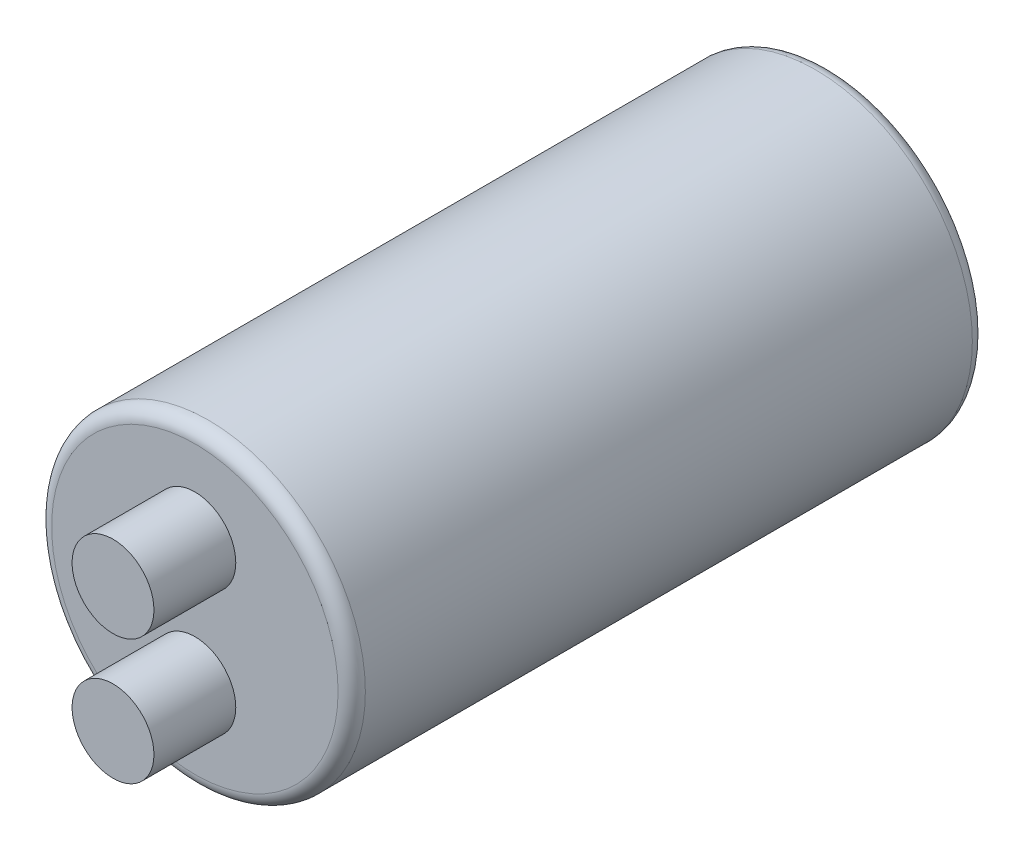
ISO-10303-21;
HEADER;
FILE_DESCRIPTION(('STEP AP214'),'2;1');
FILE_NAME('part.step','',(''),(''),'','','');
FILE_SCHEMA(('AUTOMOTIVE_DESIGN { 1 0 10303 214 1 1 1 1 }'));
ENDSEC;
DATA;
#1=APPLICATION_CONTEXT('core data for automotive mechanical design processes');
#2=APPLICATION_PROTOCOL_DEFINITION('international standard','automotive_design',2000,#1);
#3=PRODUCT_CONTEXT('',#1,'mechanical');
#4=PRODUCT('Part','Part','',(#3));
#5=PRODUCT_RELATED_PRODUCT_CATEGORY('part','',(#4));
#6=PRODUCT_DEFINITION_FORMATION('','',#4);
#7=PRODUCT_DEFINITION_CONTEXT('part definition',#1,'design');
#8=PRODUCT_DEFINITION('design','',#6,#7);
#9=PRODUCT_DEFINITION_SHAPE('','',#8);
#10=(LENGTH_UNIT() NAMED_UNIT(*) SI_UNIT(.MILLI.,.METRE.));
#11=(NAMED_UNIT(*) PLANE_ANGLE_UNIT() SI_UNIT($,.RADIAN.));
#12=(NAMED_UNIT(*) SI_UNIT($,.STERADIAN.) SOLID_ANGLE_UNIT());
#13=UNCERTAINTY_MEASURE_WITH_UNIT(LENGTH_MEASURE(1.E-05),#10,'distance_accuracy_value','');
#14=(GEOMETRIC_REPRESENTATION_CONTEXT(3) GLOBAL_UNCERTAINTY_ASSIGNED_CONTEXT((#13)) GLOBAL_UNIT_ASSIGNED_CONTEXT((#10,
#11,#12)) REPRESENTATION_CONTEXT('',''));
#15=CARTESIAN_POINT('',(0.,0.,0.));
#16=DIRECTION('',(0.,0.,1.));
#17=DIRECTION('',(1.,0.,0.));
#18=AXIS2_PLACEMENT_3D('',#15,#16,#17);
#19=CARTESIAN_POINT('',(0.,0.,46.5));
#20=DIRECTION('',(0.,0.,1.));
#21=DIRECTION('',(1.,0.,0.));
#22=AXIS2_PLACEMENT_3D('',#19,#20,#21);
#23=PLANE('',#22);
#24=CARTESIAN_POINT('',(0.,-4.74446928174643,46.5));
#25=DIRECTION('',(0.,0.,1.));
#26=DIRECTION('',(1.,0.,0.));
#27=AXIS2_PLACEMENT_3D('',#24,#25,#26);
#28=CIRCLE('',#27,3.);
#29=CARTESIAN_POINT('',(3.,-4.74446928174643,46.5));
#30=VERTEX_POINT('',#29);
#31=EDGE_CURVE('E51',#30,#30,#28,.T.);
#32=ORIENTED_EDGE('',*,*,#31,.F.);
#33=EDGE_LOOP('',(#32));
#34=FACE_BOUND('',#33,.T.);
#35=CARTESIAN_POINT('',(0.,0.,46.5));
#36=DIRECTION('',(0.,0.,1.));
#37=DIRECTION('',(1.,0.,0.));
#38=AXIS2_PLACEMENT_3D('',#35,#36,#37);
#39=CIRCLE('',#38,10.5);
#40=CARTESIAN_POINT('',(10.5,0.,46.5));
#41=VERTEX_POINT('',#40);
#42=EDGE_CURVE('E45',#41,#41,#39,.T.);
#43=ORIENTED_EDGE('',*,*,#42,.T.);
#44=EDGE_LOOP('',(#43));
#45=FACE_BOUND('',#44,.T.);
#46=CARTESIAN_POINT('',(0.,4.44181711904434,46.5));
#47=DIRECTION('',(0.,0.,1.));
#48=DIRECTION('',(1.,0.,0.));
#49=AXIS2_PLACEMENT_3D('',#46,#47,#48);
#50=CIRCLE('',#49,3.);
#51=CARTESIAN_POINT('',(3.,4.44181711904434,46.5));
#52=VERTEX_POINT('',#51);
#53=EDGE_CURVE('E57',#52,#52,#50,.T.);
#54=ORIENTED_EDGE('',*,*,#53,.F.);
#55=EDGE_LOOP('',(#54));
#56=FACE_BOUND('',#55,.T.);
#57=ADVANCED_FACE('F30',(#34,#45,#56),#23,.T.);
#58=CARTESIAN_POINT('',(0.,0.,46.5));
#59=DIRECTION('',(0.,0.,-1.));
#60=DIRECTION('',(-1.,0.,0.));
#61=AXIS2_PLACEMENT_3D('',#58,#59,#60);
#62=CYLINDRICAL_SURFACE('',#61,11.5);
#63=CARTESIAN_POINT('',(0.,0.,45.5));
#64=DIRECTION('',(0.,0.,1.));
#65=DIRECTION('',(1.,0.,0.));
#66=AXIS2_PLACEMENT_3D('',#63,#64,#65);
#67=CIRCLE('',#66,11.5);
#68=CARTESIAN_POINT('',(-11.5,0.,45.5));
#69=VERTEX_POINT('',#68);
#70=EDGE_CURVE('E37',#69,#69,#67,.F.);
#71=CARTESIAN_POINT('',(0.,0.,1.));
#72=DIRECTION('',(0.,0.,1.));
#73=DIRECTION('',(1.,0.,0.));
#74=AXIS2_PLACEMENT_3D('',#71,#72,#73);
#75=CIRCLE('',#74,11.5);
#76=CARTESIAN_POINT('',(-11.5,0.,0.999999999999994));
#77=VERTEX_POINT('',#76);
#78=EDGE_CURVE('E41',#77,#77,#75,.T.);
#79=CARTESIAN_POINT('',(-11.5,0.,45.5));
#80=CARTESIAN_POINT('',(-11.5,0.,45.0364583333333));
#81=CARTESIAN_POINT('',(-11.5,0.,44.5729166666667));
#82=CARTESIAN_POINT('',(-11.5,0.,43.6458333333333));
#83=CARTESIAN_POINT('',(-11.5,0.,43.1822916666667));
#84=CARTESIAN_POINT('',(-11.5,0.,42.2552083333333));
#85=CARTESIAN_POINT('',(-11.5,0.,41.7916666666667));
#86=CARTESIAN_POINT('',(-11.5,0.,40.8645833333333));
#87=CARTESIAN_POINT('',(-11.5,0.,40.4010416666667));
#88=CARTESIAN_POINT('',(-11.5,0.,39.4739583333333));
#89=CARTESIAN_POINT('',(-11.5,0.,39.0104166666667));
#90=CARTESIAN_POINT('',(-11.5,0.,38.0833333333333));
#91=CARTESIAN_POINT('',(-11.5,0.,37.6197916666667));
#92=CARTESIAN_POINT('',(-11.5,0.,36.6927083333333));
#93=CARTESIAN_POINT('',(-11.5,0.,36.2291666666667));
#94=CARTESIAN_POINT('',(-11.5,0.,35.3020833333333));
#95=CARTESIAN_POINT('',(-11.5,0.,34.8385416666667));
#96=CARTESIAN_POINT('',(-11.5,0.,33.9114583333333));
#97=CARTESIAN_POINT('',(-11.5,0.,33.4479166666667));
#98=CARTESIAN_POINT('',(-11.5,0.,32.5208333333333));
#99=CARTESIAN_POINT('',(-11.5,0.,32.0572916666667));
#100=CARTESIAN_POINT('',(-11.5,0.,31.1302083333333));
#101=CARTESIAN_POINT('',(-11.5,0.,30.6666666666667));
#102=CARTESIAN_POINT('',(-11.5,0.,29.7395833333333));
#103=CARTESIAN_POINT('',(-11.5,0.,29.2760416666667));
#104=CARTESIAN_POINT('',(-11.5,0.,28.3489583333333));
#105=CARTESIAN_POINT('',(-11.5,0.,27.8854166666667));
#106=CARTESIAN_POINT('',(-11.5,0.,26.9583333333333));
#107=CARTESIAN_POINT('',(-11.5,0.,26.4947916666667));
#108=CARTESIAN_POINT('',(-11.5,0.,25.5677083333333));
#109=CARTESIAN_POINT('',(-11.5,0.,25.1041666666667));
#110=CARTESIAN_POINT('',(-11.5,0.,24.1770833333333));
#111=CARTESIAN_POINT('',(-11.5,0.,23.7135416666667));
#112=CARTESIAN_POINT('',(-11.5,0.,22.7864583333333));
#113=CARTESIAN_POINT('',(-11.5,0.,22.3229166666667));
#114=CARTESIAN_POINT('',(-11.5,0.,21.3958333333333));
#115=CARTESIAN_POINT('',(-11.5,0.,20.9322916666667));
#116=CARTESIAN_POINT('',(-11.5,0.,20.0052083333333));
#117=CARTESIAN_POINT('',(-11.5,0.,19.5416666666667));
#118=CARTESIAN_POINT('',(-11.5,0.,18.6145833333333));
#119=CARTESIAN_POINT('',(-11.5,0.,18.1510416666667));
#120=CARTESIAN_POINT('',(-11.5,0.,17.2239583333333));
#121=CARTESIAN_POINT('',(-11.5,0.,16.7604166666667));
#122=CARTESIAN_POINT('',(-11.5,0.,15.8333333333333));
#123=CARTESIAN_POINT('',(-11.5,0.,15.3697916666667));
#124=CARTESIAN_POINT('',(-11.5,0.,14.4427083333333));
#125=CARTESIAN_POINT('',(-11.5,0.,13.9791666666667));
#126=CARTESIAN_POINT('',(-11.5,0.,13.0520833333333));
#127=CARTESIAN_POINT('',(-11.5,0.,12.5885416666667));
#128=CARTESIAN_POINT('',(-11.5,0.,11.6614583333333));
#129=CARTESIAN_POINT('',(-11.5,0.,11.1979166666667));
#130=CARTESIAN_POINT('',(-11.5,0.,10.2708333333333));
#131=CARTESIAN_POINT('',(-11.5,0.,9.80729166666666));
#132=CARTESIAN_POINT('',(-11.5,0.,8.88020833333333));
#133=CARTESIAN_POINT('',(-11.5,0.,8.41666666666666));
#134=CARTESIAN_POINT('',(-11.5,0.,7.48958333333333));
#135=CARTESIAN_POINT('',(-11.5,0.,7.02604166666666));
#136=CARTESIAN_POINT('',(-11.5,0.,6.09895833333333));
#137=CARTESIAN_POINT('',(-11.5,0.,5.63541666666666));
#138=CARTESIAN_POINT('',(-11.5,0.,4.70833333333333));
#139=CARTESIAN_POINT('',(-11.5,0.,4.24479166666666));
#140=CARTESIAN_POINT('',(-11.5,0.,3.31770833333333));
#141=CARTESIAN_POINT('',(-11.5,0.,2.85416666666666));
#142=CARTESIAN_POINT('',(-11.5,0.,1.92708333333333));
#143=CARTESIAN_POINT('',(-11.5,0.,1.46354166666666));
#144=CARTESIAN_POINT('',(-11.5,0.,0.999999999999994));
#145=B_SPLINE_CURVE_WITH_KNOTS('',3,(#79,#80,#81,#82,#83,#84,#85,#86,#87,#88,#89,#90,#91,#92,
#93,#94,#95,#96,#97,#98,#99,#100,#101,#102,#103,#104,#105,#106,#107,#108,#109,#110,#111,#112,
#113,#114,#115,#116,#117,#118,#119,#120,#121,#122,#123,#124,#125,#126,#127,#128,#129,#130,#131,
#132,#133,#134,#135,#136,#137,#138,#139,#140,#141,#142,#143,#144),.UNSPECIFIED.,.F.,.F.,(4,2,2,
2,2,2,2,2,2,2,2,2,2,2,2,2,2,2,2,2,2,2,2,2,2,2,2,2,2,2,2,2,4),(0.,1.390625,2.78125,4.171875,
5.5625,6.953125,8.34375,9.734375,11.125,12.515625,13.90625,15.296875,16.6875,18.078125,19.46875,
20.859375,22.25,23.640625,25.03125,26.421875,27.8125,29.203125,30.59375,31.984375,33.375,
34.765625,36.15625,37.546875,38.9375,40.328125,41.71875,43.109375,44.5),.UNSPECIFIED.);
#146=EDGE_CURVE('BSEAM73',#69,#77,#145,.T.);
#147=ORIENTED_EDGE('',*,*,#70,.T.);
#148=ORIENTED_EDGE('',*,*,#78,.T.);
#149=ORIENTED_EDGE('',*,*,#146,.T.);
#150=ORIENTED_EDGE('',*,*,#146,.F.);
#151=EDGE_LOOP('',(#147,#149,#148,#150));
#152=FACE_BOUND('',#151,.T.);
#153=ADVANCED_FACE('F73',(#152),#62,.T.);
#154=CARTESIAN_POINT('',(0.,0.,0.));
#155=DIRECTION('',(0.,0.,1.));
#156=DIRECTION('',(1.,0.,0.));
#157=AXIS2_PLACEMENT_3D('',#154,#155,#156);
#158=PLANE('',#157);
#159=CARTESIAN_POINT('',(0.,0.,0.));
#160=DIRECTION('',(0.,0.,1.));
#161=DIRECTION('',(1.,0.,0.));
#162=AXIS2_PLACEMENT_3D('',#159,#160,#161);
#163=CIRCLE('',#162,10.5);
#164=CARTESIAN_POINT('',(10.5,0.,0.));
#165=VERTEX_POINT('',#164);
#166=EDGE_CURVE('E10',#165,#165,#163,.F.);
#167=ORIENTED_EDGE('',*,*,#166,.T.);
#168=EDGE_LOOP('',(#167));
#169=FACE_BOUND('',#168,.T.);
#170=ADVANCED_FACE('F79',(#169),#158,.F.);
#171=CARTESIAN_POINT('',(0.,0.,45.5));
#172=DIRECTION('',(0.,0.,1.));
#173=DIRECTION('',(1.,0.,0.));
#174=AXIS2_PLACEMENT_3D('',#171,#172,#173);
#175=TOROIDAL_SURFACE('',#174,10.5,1.);
#176=ORIENTED_EDGE('',*,*,#70,.F.);
#177=EDGE_LOOP('',(#176));
#178=FACE_BOUND('',#177,.T.);
#179=ORIENTED_EDGE('',*,*,#42,.F.);
#180=EDGE_LOOP('',(#179));
#181=FACE_BOUND('',#180,.T.);
#182=ADVANCED_FACE('F88',(#178,#181),#175,.T.);
#183=CARTESIAN_POINT('',(0.,0.,1.));
#184=DIRECTION('',(0.,0.,1.));
#185=DIRECTION('',(1.,0.,0.));
#186=AXIS2_PLACEMENT_3D('',#183,#184,#185);
#187=TOROIDAL_SURFACE('',#186,10.5,1.);
#188=ORIENTED_EDGE('',*,*,#166,.F.);
#189=EDGE_LOOP('',(#188));
#190=FACE_BOUND('',#189,.T.);
#191=ORIENTED_EDGE('',*,*,#78,.F.);
#192=EDGE_LOOP('',(#191));
#193=FACE_BOUND('',#192,.T.);
#194=ADVANCED_FACE('F32',(#190,#193),#187,.T.);
#195=CARTESIAN_POINT('',(0.,-4.74446928174643,52.5));
#196=DIRECTION('',(0.,0.,-1.));
#197=DIRECTION('',(-1.,0.,0.));
#198=AXIS2_PLACEMENT_3D('',#195,#196,#197);
#199=CYLINDRICAL_SURFACE('',#198,3.);
#200=CARTESIAN_POINT('',(0.,-4.74446928174643,52.5));
#201=DIRECTION('',(0.,0.,1.));
#202=DIRECTION('',(1.,0.,0.));
#203=AXIS2_PLACEMENT_3D('',#200,#201,#202);
#204=CIRCLE('',#203,3.);
#205=CARTESIAN_POINT('',(3.,-4.74446928174643,52.5));
#206=VERTEX_POINT('',#205);
#207=EDGE_CURVE('E50',#206,#206,#204,.T.);
#208=ORIENTED_EDGE('',*,*,#207,.F.);
#209=EDGE_LOOP('',(#208));
#210=FACE_BOUND('',#209,.T.);
#211=ORIENTED_EDGE('',*,*,#31,.T.);
#212=EDGE_LOOP('',(#211));
#213=FACE_BOUND('',#212,.T.);
#214=ADVANCED_FACE('F85',(#210,#213),#199,.T.);
#215=CARTESIAN_POINT('',(0.,-4.74446928174643,52.5));
#216=DIRECTION('',(0.,0.,1.));
#217=DIRECTION('',(1.,0.,0.));
#218=AXIS2_PLACEMENT_3D('',#215,#216,#217);
#219=PLANE('',#218);
#220=ORIENTED_EDGE('',*,*,#207,.T.);
#221=EDGE_LOOP('',(#220));
#222=FACE_BOUND('',#221,.T.);
#223=ADVANCED_FACE('F68',(#222),#219,.T.);
#224=CARTESIAN_POINT('',(0.,4.44181711904434,52.5));
#225=DIRECTION('',(0.,0.,-1.));
#226=DIRECTION('',(-1.,0.,0.));
#227=AXIS2_PLACEMENT_3D('',#224,#225,#226);
#228=CYLINDRICAL_SURFACE('',#227,3.);
#229=CARTESIAN_POINT('',(0.,4.44181711904434,52.5));
#230=DIRECTION('',(0.,0.,1.));
#231=DIRECTION('',(1.,0.,0.));
#232=AXIS2_PLACEMENT_3D('',#229,#230,#231);
#233=CIRCLE('',#232,3.);
#234=CARTESIAN_POINT('',(3.,4.44181711904434,52.5));
#235=VERTEX_POINT('',#234);
#236=EDGE_CURVE('E54',#235,#235,#233,.T.);
#237=ORIENTED_EDGE('',*,*,#236,.F.);
#238=EDGE_LOOP('',(#237));
#239=FACE_BOUND('',#238,.T.);
#240=ORIENTED_EDGE('',*,*,#53,.T.);
#241=EDGE_LOOP('',(#240));
#242=FACE_BOUND('',#241,.T.);
#243=ADVANCED_FACE('F65',(#239,#242),#228,.T.);
#244=CARTESIAN_POINT('',(0.,4.44181711904434,52.5));
#245=DIRECTION('',(0.,0.,1.));
#246=DIRECTION('',(1.,0.,0.));
#247=AXIS2_PLACEMENT_3D('',#244,#245,#246);
#248=PLANE('',#247);
#249=ORIENTED_EDGE('',*,*,#236,.T.);
#250=EDGE_LOOP('',(#249));
#251=FACE_BOUND('',#250,.T.);
#252=ADVANCED_FACE('F63',(#251),#248,.T.);
#253=CLOSED_SHELL('',(#57,#153,#170,#182,#194,#214,#223,#243,#252));
#254=MANIFOLD_SOLID_BREP('B2',#253);
#255=ADVANCED_BREP_SHAPE_REPRESENTATION('',(#18,#254),#14);
#256=SHAPE_DEFINITION_REPRESENTATION(#9,#255);
ENDSEC;
END-ISO-10303-21;
